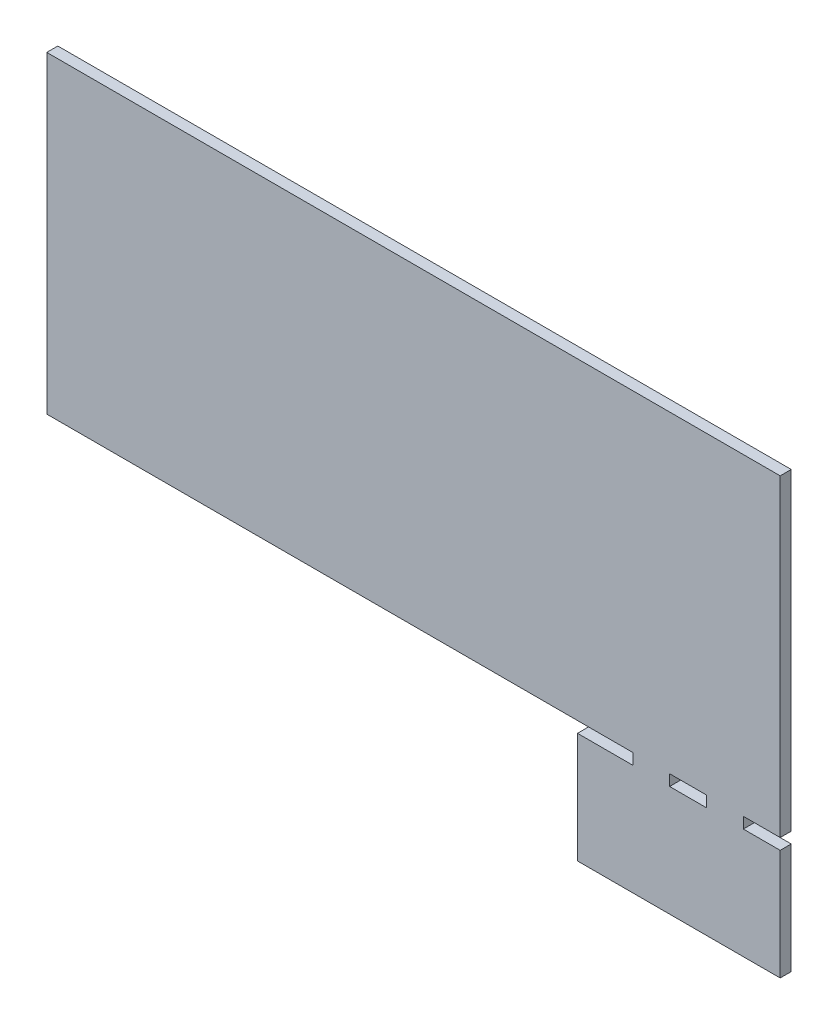
ISO-10303-21;
HEADER;
FILE_DESCRIPTION(('STEP AP214'),'2;1');
FILE_NAME('part.step','',(''),(''),'','','');
FILE_SCHEMA(('AUTOMOTIVE_DESIGN { 1 0 10303 214 1 1 1 1 }'));
ENDSEC;
DATA;
#1=APPLICATION_CONTEXT('core data for automotive mechanical design processes');
#2=APPLICATION_PROTOCOL_DEFINITION('international standard','automotive_design',2000,#1);
#3=PRODUCT_CONTEXT('',#1,'mechanical');
#4=PRODUCT('Part','Part','',(#3));
#5=PRODUCT_RELATED_PRODUCT_CATEGORY('part','',(#4));
#6=PRODUCT_DEFINITION_FORMATION('','',#4);
#7=PRODUCT_DEFINITION_CONTEXT('part definition',#1,'design');
#8=PRODUCT_DEFINITION('design','',#6,#7);
#9=PRODUCT_DEFINITION_SHAPE('','',#8);
#10=(LENGTH_UNIT() NAMED_UNIT(*) SI_UNIT(.MILLI.,.METRE.));
#11=(NAMED_UNIT(*) PLANE_ANGLE_UNIT() SI_UNIT($,.RADIAN.));
#12=(NAMED_UNIT(*) SI_UNIT($,.STERADIAN.) SOLID_ANGLE_UNIT());
#13=UNCERTAINTY_MEASURE_WITH_UNIT(LENGTH_MEASURE(1.E-05),#10,'distance_accuracy_value','');
#14=(GEOMETRIC_REPRESENTATION_CONTEXT(3) GLOBAL_UNCERTAINTY_ASSIGNED_CONTEXT((#13)) GLOBAL_UNIT_ASSIGNED_CONTEXT((#10,
#11,#12)) REPRESENTATION_CONTEXT('',''));
#15=CARTESIAN_POINT('',(0.,0.,0.));
#16=DIRECTION('',(0.,0.,1.));
#17=DIRECTION('',(1.,0.,0.));
#18=AXIS2_PLACEMENT_3D('',#15,#16,#17);
#19=CARTESIAN_POINT('',(0.,0.,3.));
#20=DIRECTION('',(0.,0.,-1.));
#21=DIRECTION('',(-1.,0.,0.));
#22=AXIS2_PLACEMENT_3D('',#19,#20,#21);
#23=PLANE('',#22);
#24=DIRECTION('',(1.,0.,0.));
#25=VECTOR('',#24,1.);
#26=CARTESIAN_POINT('',(27.5,60.5,3.));
#27=LINE('',#26,#25);
#28=CARTESIAN_POINT('',(-171.5,60.5,3.));
#29=VERTEX_POINT('',#28);
#30=CARTESIAN_POINT('',(27.5,60.5,3.));
#31=VERTEX_POINT('',#30);
#32=EDGE_CURVE('E162',#29,#31,#27,.T.);
#33=ORIENTED_EDGE('',*,*,#32,.F.);
#34=DIRECTION('',(0.,1.,0.));
#35=VECTOR('',#34,1.);
#36=CARTESIAN_POINT('',(-171.5,-24.5,3.));
#37=LINE('',#36,#35);
#38=CARTESIAN_POINT('',(-171.5,-24.5,3.));
#39=VERTEX_POINT('',#38);
#40=EDGE_CURVE('E147',#39,#29,#37,.T.);
#41=ORIENTED_EDGE('',*,*,#40,.F.);
#42=DIRECTION('',(-1.,0.,0.));
#43=VECTOR('',#42,1.);
#44=CARTESIAN_POINT('',(-12.5,-24.5,3.));
#45=LINE('',#44,#43);
#46=CARTESIAN_POINT('',(-12.5,-24.5,3.));
#47=VERTEX_POINT('',#46);
#48=EDGE_CURVE('E219',#47,#39,#45,.T.);
#49=ORIENTED_EDGE('',*,*,#48,.F.);
#50=DIRECTION('',(0.,-1.,0.));
#51=VECTOR('',#50,1.);
#52=CARTESIAN_POINT('',(-12.5,-24.5,3.));
#53=LINE('',#52,#51);
#54=CARTESIAN_POINT('',(-12.5,-27.5,3.));
#55=VERTEX_POINT('',#54);
#56=EDGE_CURVE('E215',#47,#55,#53,.T.);
#57=ORIENTED_EDGE('',*,*,#56,.T.);
#58=DIRECTION('',(1.,0.,0.));
#59=VECTOR('',#58,1.);
#60=CARTESIAN_POINT('',(-27.5,-27.5,3.));
#61=LINE('',#60,#59);
#62=CARTESIAN_POINT('',(-27.5,-27.5,3.));
#63=VERTEX_POINT('',#62);
#64=EDGE_CURVE('E182',#63,#55,#61,.T.);
#65=ORIENTED_EDGE('',*,*,#64,.F.);
#66=DIRECTION('',(0.,1.,0.));
#67=VECTOR('',#66,1.);
#68=CARTESIAN_POINT('',(-27.5,-57.5,3.));
#69=LINE('',#68,#67);
#70=CARTESIAN_POINT('',(-27.5,-57.5,3.));
#71=VERTEX_POINT('',#70);
#72=EDGE_CURVE('E177',#71,#63,#69,.T.);
#73=ORIENTED_EDGE('',*,*,#72,.F.);
#74=DIRECTION('',(-1.,0.,0.));
#75=VECTOR('',#74,1.);
#76=CARTESIAN_POINT('',(-27.5,-57.5,3.));
#77=LINE('',#76,#75);
#78=CARTESIAN_POINT('',(27.5,-57.5,3.));
#79=VERTEX_POINT('',#78);
#80=EDGE_CURVE('E188',#79,#71,#77,.T.);
#81=ORIENTED_EDGE('',*,*,#80,.F.);
#82=DIRECTION('',(0.,-1.,0.));
#83=VECTOR('',#82,1.);
#84=CARTESIAN_POINT('',(27.5,-57.5,3.));
#85=LINE('',#84,#83);
#86=CARTESIAN_POINT('',(27.5,-27.5,3.));
#87=VERTEX_POINT('',#86);
#88=EDGE_CURVE('E184',#87,#79,#85,.T.);
#89=ORIENTED_EDGE('',*,*,#88,.F.);
#90=CARTESIAN_POINT('',(17.5,-27.5,3.));
#91=VERTEX_POINT('',#90);
#92=EDGE_CURVE('E180',#91,#87,#61,.T.);
#93=ORIENTED_EDGE('',*,*,#92,.F.);
#94=DIRECTION('',(0.,-1.,0.));
#95=VECTOR('',#94,1.);
#96=CARTESIAN_POINT('',(17.5,-24.5,3.));
#97=LINE('',#96,#95);
#98=CARTESIAN_POINT('',(17.5,-24.5,3.));
#99=VERTEX_POINT('',#98);
#100=EDGE_CURVE('E231',#99,#91,#97,.T.);
#101=ORIENTED_EDGE('',*,*,#100,.F.);
#102=DIRECTION('',(-1.,0.,0.));
#103=VECTOR('',#102,1.);
#104=CARTESIAN_POINT('',(27.5,-24.5,3.));
#105=LINE('',#104,#103);
#106=CARTESIAN_POINT('',(27.5,-24.5,3.));
#107=VERTEX_POINT('',#106);
#108=EDGE_CURVE('E259',#107,#99,#105,.T.);
#109=ORIENTED_EDGE('',*,*,#108,.F.);
#110=DIRECTION('',(0.,1.,0.));
#111=VECTOR('',#110,1.);
#112=CARTESIAN_POINT('',(27.5,-27.5,3.));
#113=LINE('',#112,#111);
#114=EDGE_CURVE('E11',#107,#31,#113,.T.);
#115=ORIENTED_EDGE('',*,*,#114,.T.);
#116=EDGE_LOOP('',(#33,#41,#49,#57,#65,#73,#81,#89,#93,#101,#109,#115));
#117=FACE_BOUND('',#116,.T.);
#118=CARTESIAN_POINT('',(-2.50000000000001,-27.5,3.));
#119=VERTEX_POINT('',#118);
#120=CARTESIAN_POINT('',(7.49999999999999,-27.5,3.));
#121=VERTEX_POINT('',#120);
#122=EDGE_CURVE('E185',#119,#121,#61,.T.);
#123=ORIENTED_EDGE('',*,*,#122,.F.);
#124=DIRECTION('',(0.,-1.,0.));
#125=VECTOR('',#124,1.);
#126=CARTESIAN_POINT('',(-2.50000000000001,-24.5,3.));
#127=LINE('',#126,#125);
#128=CARTESIAN_POINT('',(-2.50000000000001,-24.5,3.));
#129=VERTEX_POINT('',#128);
#130=EDGE_CURVE('E221',#129,#119,#127,.T.);
#131=ORIENTED_EDGE('',*,*,#130,.F.);
#132=DIRECTION('',(-1.,0.,0.));
#133=VECTOR('',#132,1.);
#134=CARTESIAN_POINT('',(7.49999999999999,-24.5,3.));
#135=LINE('',#134,#133);
#136=CARTESIAN_POINT('',(7.49999999999999,-24.5,3.));
#137=VERTEX_POINT('',#136);
#138=EDGE_CURVE('E242',#137,#129,#135,.T.);
#139=ORIENTED_EDGE('',*,*,#138,.F.);
#140=DIRECTION('',(0.,-1.,0.));
#141=VECTOR('',#140,1.);
#142=CARTESIAN_POINT('',(7.49999999999999,-24.5,3.));
#143=LINE('',#142,#141);
#144=EDGE_CURVE('E239',#137,#121,#143,.T.);
#145=ORIENTED_EDGE('',*,*,#144,.T.);
#146=EDGE_LOOP('',(#123,#131,#139,#145));
#147=FACE_BOUND('',#146,.T.);
#148=ADVANCED_FACE('F33',(#117,#147),#23,.F.);
#149=CARTESIAN_POINT('',(0.,0.,0.));
#150=DIRECTION('',(0.,0.,-1.));
#151=DIRECTION('',(-1.,0.,0.));
#152=AXIS2_PLACEMENT_3D('',#149,#150,#151);
#153=PLANE('',#152);
#154=DIRECTION('',(0.,1.,0.));
#155=VECTOR('',#154,1.);
#156=CARTESIAN_POINT('',(-171.5,-24.5,0.));
#157=LINE('',#156,#155);
#158=CARTESIAN_POINT('',(-171.5,-24.5,0.));
#159=VERTEX_POINT('',#158);
#160=CARTESIAN_POINT('',(-171.5,60.5,0.));
#161=VERTEX_POINT('',#160);
#162=EDGE_CURVE('E157',#159,#161,#157,.T.);
#163=ORIENTED_EDGE('',*,*,#162,.T.);
#164=DIRECTION('',(1.,0.,0.));
#165=VECTOR('',#164,1.);
#166=CARTESIAN_POINT('',(27.5,60.5,0.));
#167=LINE('',#166,#165);
#168=CARTESIAN_POINT('',(27.5,60.5,0.));
#169=VERTEX_POINT('',#168);
#170=EDGE_CURVE('E163',#161,#169,#167,.T.);
#171=ORIENTED_EDGE('',*,*,#170,.T.);
#172=DIRECTION('',(0.,1.,0.));
#173=VECTOR('',#172,1.);
#174=CARTESIAN_POINT('',(27.5,-27.5,0.));
#175=LINE('',#174,#173);
#176=CARTESIAN_POINT('',(27.5,-24.5,0.));
#177=VERTEX_POINT('',#176);
#178=EDGE_CURVE('E37',#177,#169,#175,.T.);
#179=ORIENTED_EDGE('',*,*,#178,.F.);
#180=DIRECTION('',(-1.,0.,0.));
#181=VECTOR('',#180,1.);
#182=CARTESIAN_POINT('',(27.5,-24.5,0.));
#183=LINE('',#182,#181);
#184=CARTESIAN_POINT('',(17.5,-24.5,0.));
#185=VERTEX_POINT('',#184);
#186=EDGE_CURVE('E258',#177,#185,#183,.T.);
#187=ORIENTED_EDGE('',*,*,#186,.T.);
#188=DIRECTION('',(0.,-1.,0.));
#189=VECTOR('',#188,1.);
#190=CARTESIAN_POINT('',(17.5,-24.5,0.));
#191=LINE('',#190,#189);
#192=CARTESIAN_POINT('',(17.5,-27.5,0.));
#193=VERTEX_POINT('',#192);
#194=EDGE_CURVE('E262',#185,#193,#191,.T.);
#195=ORIENTED_EDGE('',*,*,#194,.T.);
#196=DIRECTION('',(1.,0.,0.));
#197=VECTOR('',#196,1.);
#198=CARTESIAN_POINT('',(-27.5,-27.5,0.));
#199=LINE('',#198,#197);
#200=CARTESIAN_POINT('',(27.5,-27.5,0.));
#201=VERTEX_POINT('',#200);
#202=EDGE_CURVE('E194',#193,#201,#199,.T.);
#203=ORIENTED_EDGE('',*,*,#202,.T.);
#204=DIRECTION('',(0.,-1.,0.));
#205=VECTOR('',#204,1.);
#206=CARTESIAN_POINT('',(27.5,-57.5,0.));
#207=LINE('',#206,#205);
#208=CARTESIAN_POINT('',(27.5,-57.5,0.));
#209=VERTEX_POINT('',#208);
#210=EDGE_CURVE('E198',#201,#209,#207,.T.);
#211=ORIENTED_EDGE('',*,*,#210,.T.);
#212=DIRECTION('',(-1.,0.,0.));
#213=VECTOR('',#212,1.);
#214=CARTESIAN_POINT('',(-27.5,-57.5,0.));
#215=LINE('',#214,#213);
#216=CARTESIAN_POINT('',(-27.5,-57.5,0.));
#217=VERTEX_POINT('',#216);
#218=EDGE_CURVE('E181',#209,#217,#215,.T.);
#219=ORIENTED_EDGE('',*,*,#218,.T.);
#220=DIRECTION('',(0.,1.,0.));
#221=VECTOR('',#220,1.);
#222=CARTESIAN_POINT('',(-27.5,-57.5,0.));
#223=LINE('',#222,#221);
#224=CARTESIAN_POINT('',(-27.5,-27.5,0.));
#225=VERTEX_POINT('',#224);
#226=EDGE_CURVE('E176',#217,#225,#223,.T.);
#227=ORIENTED_EDGE('',*,*,#226,.T.);
#228=CARTESIAN_POINT('',(-12.5,-27.5,0.));
#229=VERTEX_POINT('',#228);
#230=EDGE_CURVE('E195',#225,#229,#199,.T.);
#231=ORIENTED_EDGE('',*,*,#230,.T.);
#232=DIRECTION('',(0.,-1.,0.));
#233=VECTOR('',#232,1.);
#234=CARTESIAN_POINT('',(-12.5,-24.5,0.));
#235=LINE('',#234,#233);
#236=CARTESIAN_POINT('',(-12.5,-24.5,0.));
#237=VERTEX_POINT('',#236);
#238=EDGE_CURVE('E214',#237,#229,#235,.T.);
#239=ORIENTED_EDGE('',*,*,#238,.F.);
#240=DIRECTION('',(-1.,0.,0.));
#241=VECTOR('',#240,1.);
#242=CARTESIAN_POINT('',(-12.5,-24.5,0.));
#243=LINE('',#242,#241);
#244=EDGE_CURVE('E48',#237,#159,#243,.T.);
#245=ORIENTED_EDGE('',*,*,#244,.T.);
#246=EDGE_LOOP('',(#163,#171,#179,#187,#195,#203,#211,#219,#227,#231,#239,#245));
#247=FACE_BOUND('',#246,.T.);
#248=DIRECTION('',(0.,-1.,0.));
#249=VECTOR('',#248,1.);
#250=CARTESIAN_POINT('',(-2.50000000000001,-24.5,0.));
#251=LINE('',#250,#249);
#252=CARTESIAN_POINT('',(-2.50000000000001,-24.5,0.));
#253=VERTEX_POINT('',#252);
#254=CARTESIAN_POINT('',(-2.50000000000001,-27.5,0.));
#255=VERTEX_POINT('',#254);
#256=EDGE_CURVE('E243',#253,#255,#251,.T.);
#257=ORIENTED_EDGE('',*,*,#256,.T.);
#258=CARTESIAN_POINT('',(7.49999999999999,-27.5,0.));
#259=VERTEX_POINT('',#258);
#260=EDGE_CURVE('E199',#255,#259,#199,.T.);
#261=ORIENTED_EDGE('',*,*,#260,.T.);
#262=DIRECTION('',(0.,-1.,0.));
#263=VECTOR('',#262,1.);
#264=CARTESIAN_POINT('',(7.49999999999999,-24.5,0.));
#265=LINE('',#264,#263);
#266=CARTESIAN_POINT('',(7.49999999999999,-24.5,0.));
#267=VERTEX_POINT('',#266);
#268=EDGE_CURVE('E238',#267,#259,#265,.T.);
#269=ORIENTED_EDGE('',*,*,#268,.F.);
#270=DIRECTION('',(-1.,0.,0.));
#271=VECTOR('',#270,1.);
#272=CARTESIAN_POINT('',(7.49999999999999,-24.5,0.));
#273=LINE('',#272,#271);
#274=EDGE_CURVE('E56',#267,#253,#273,.T.);
#275=ORIENTED_EDGE('',*,*,#274,.T.);
#276=EDGE_LOOP('',(#257,#261,#269,#275));
#277=FACE_BOUND('',#276,.T.);
#278=ADVANCED_FACE('F269',(#247,#277),#153,.T.);
#279=CARTESIAN_POINT('',(27.5,-27.5,3.));
#280=DIRECTION('',(-1.,0.,0.));
#281=DIRECTION('',(0.,0.,1.));
#282=AXIS2_PLACEMENT_3D('',#279,#280,#281);
#283=PLANE('',#282);
#284=ORIENTED_EDGE('',*,*,#114,.F.);
#285=DIRECTION('',(0.,0.,1.));
#286=VECTOR('',#285,1.);
#287=CARTESIAN_POINT('',(27.5,-24.5,0.));
#288=LINE('',#287,#286);
#289=EDGE_CURVE('E256',#177,#107,#288,.T.);
#290=ORIENTED_EDGE('',*,*,#289,.F.);
#291=ORIENTED_EDGE('',*,*,#178,.T.);
#292=DIRECTION('',(0.,0.,-1.));
#293=VECTOR('',#292,1.);
#294=CARTESIAN_POINT('',(27.5,60.5,3.));
#295=LINE('',#294,#293);
#296=EDGE_CURVE('E164',#31,#169,#295,.T.);
#297=ORIENTED_EDGE('',*,*,#296,.F.);
#298=EDGE_LOOP('',(#284,#290,#291,#297));
#299=FACE_BOUND('',#298,.T.);
#300=ADVANCED_FACE('F35',(#299),#283,.F.);
#301=CARTESIAN_POINT('',(17.5,-24.5,0.));
#302=DIRECTION('',(-1.,0.,0.));
#303=DIRECTION('',(0.,0.,1.));
#304=AXIS2_PLACEMENT_3D('',#301,#302,#303);
#305=PLANE('',#304);
#306=ORIENTED_EDGE('',*,*,#100,.T.);
#307=DIRECTION('',(0.,0.,1.));
#308=VECTOR('',#307,1.);
#309=CARTESIAN_POINT('',(17.5,-27.5,0.));
#310=LINE('',#309,#308);
#311=EDGE_CURVE('E206',#193,#91,#310,.T.);
#312=ORIENTED_EDGE('',*,*,#311,.F.);
#313=ORIENTED_EDGE('',*,*,#194,.F.);
#314=DIRECTION('',(0.,0.,1.));
#315=VECTOR('',#314,1.);
#316=CARTESIAN_POINT('',(17.5,-24.5,0.));
#317=LINE('',#316,#315);
#318=EDGE_CURVE('E254',#185,#99,#317,.T.);
#319=ORIENTED_EDGE('',*,*,#318,.T.);
#320=EDGE_LOOP('',(#306,#312,#313,#319));
#321=FACE_BOUND('',#320,.T.);
#322=ADVANCED_FACE('F275',(#321),#305,.F.);
#323=CARTESIAN_POINT('',(27.5,-24.5,0.));
#324=DIRECTION('',(0.,1.,0.));
#325=DIRECTION('',(0.,0.,1.));
#326=AXIS2_PLACEMENT_3D('',#323,#324,#325);
#327=PLANE('',#326);
#328=ORIENTED_EDGE('',*,*,#108,.T.);
#329=ORIENTED_EDGE('',*,*,#318,.F.);
#330=ORIENTED_EDGE('',*,*,#186,.F.);
#331=ORIENTED_EDGE('',*,*,#289,.T.);
#332=EDGE_LOOP('',(#328,#329,#330,#331));
#333=FACE_BOUND('',#332,.T.);
#334=ADVANCED_FACE('F277',(#333),#327,.F.);
#335=CARTESIAN_POINT('',(-2.50000000000001,-24.5,0.));
#336=DIRECTION('',(-1.,0.,0.));
#337=DIRECTION('',(0.,-1.,0.));
#338=AXIS2_PLACEMENT_3D('',#335,#336,#337);
#339=PLANE('',#338);
#340=ORIENTED_EDGE('',*,*,#130,.T.);
#341=DIRECTION('',(0.,0.,1.));
#342=VECTOR('',#341,1.);
#343=CARTESIAN_POINT('',(-2.50000000000001,-27.5,0.));
#344=LINE('',#343,#342);
#345=EDGE_CURVE('E228',#255,#119,#344,.T.);
#346=ORIENTED_EDGE('',*,*,#345,.F.);
#347=ORIENTED_EDGE('',*,*,#256,.F.);
#348=DIRECTION('',(0.,0.,1.));
#349=VECTOR('',#348,1.);
#350=CARTESIAN_POINT('',(-2.50000000000001,-24.5,0.));
#351=LINE('',#350,#349);
#352=EDGE_CURVE('E230',#253,#129,#351,.T.);
#353=ORIENTED_EDGE('',*,*,#352,.T.);
#354=EDGE_LOOP('',(#340,#346,#347,#353));
#355=FACE_BOUND('',#354,.T.);
#356=ADVANCED_FACE('F299',(#355),#339,.F.);
#357=CARTESIAN_POINT('',(7.49999999999999,-24.5,0.));
#358=DIRECTION('',(0.,1.,0.));
#359=DIRECTION('',(0.,0.,1.));
#360=AXIS2_PLACEMENT_3D('',#357,#358,#359);
#361=PLANE('',#360);
#362=ORIENTED_EDGE('',*,*,#138,.T.);
#363=ORIENTED_EDGE('',*,*,#352,.F.);
#364=ORIENTED_EDGE('',*,*,#274,.F.);
#365=DIRECTION('',(0.,0.,1.));
#366=VECTOR('',#365,1.);
#367=CARTESIAN_POINT('',(7.49999999999999,-24.5,0.));
#368=LINE('',#367,#366);
#369=EDGE_CURVE('E233',#267,#137,#368,.T.);
#370=ORIENTED_EDGE('',*,*,#369,.T.);
#371=EDGE_LOOP('',(#362,#363,#364,#370));
#372=FACE_BOUND('',#371,.T.);
#373=ADVANCED_FACE('F296',(#372),#361,.F.);
#374=CARTESIAN_POINT('',(7.49999999999999,-24.5,0.));
#375=DIRECTION('',(-1.,0.,0.));
#376=DIRECTION('',(0.,0.,1.));
#377=AXIS2_PLACEMENT_3D('',#374,#375,#376);
#378=PLANE('',#377);
#379=ORIENTED_EDGE('',*,*,#144,.F.);
#380=ORIENTED_EDGE('',*,*,#369,.F.);
#381=ORIENTED_EDGE('',*,*,#268,.T.);
#382=DIRECTION('',(0.,0.,1.));
#383=VECTOR('',#382,1.);
#384=CARTESIAN_POINT('',(7.49999999999999,-27.5,0.));
#385=LINE('',#384,#383);
#386=EDGE_CURVE('E235',#259,#121,#385,.T.);
#387=ORIENTED_EDGE('',*,*,#386,.T.);
#388=EDGE_LOOP('',(#379,#380,#381,#387));
#389=FACE_BOUND('',#388,.T.);
#390=ADVANCED_FACE('F293',(#389),#378,.T.);
#391=CARTESIAN_POINT('',(-12.5,-24.5,0.));
#392=DIRECTION('',(0.,1.,0.));
#393=DIRECTION('',(0.,0.,1.));
#394=AXIS2_PLACEMENT_3D('',#391,#392,#393);
#395=PLANE('',#394);
#396=ORIENTED_EDGE('',*,*,#48,.T.);
#397=DIRECTION('',(0.,0.,-1.));
#398=VECTOR('',#397,1.);
#399=CARTESIAN_POINT('',(-171.5,-24.5,3.));
#400=LINE('',#399,#398);
#401=EDGE_CURVE('E153',#39,#159,#400,.T.);
#402=ORIENTED_EDGE('',*,*,#401,.T.);
#403=ORIENTED_EDGE('',*,*,#244,.F.);
#404=DIRECTION('',(0.,0.,1.));
#405=VECTOR('',#404,1.);
#406=CARTESIAN_POINT('',(-12.5,-24.5,0.));
#407=LINE('',#406,#405);
#408=EDGE_CURVE('E226',#237,#47,#407,.T.);
#409=ORIENTED_EDGE('',*,*,#408,.T.);
#410=EDGE_LOOP('',(#396,#402,#403,#409));
#411=FACE_BOUND('',#410,.T.);
#412=ADVANCED_FACE('F319',(#411),#395,.F.);
#413=CARTESIAN_POINT('',(-12.5,-24.5,0.));
#414=DIRECTION('',(-1.,0.,0.));
#415=DIRECTION('',(0.,0.,1.));
#416=AXIS2_PLACEMENT_3D('',#413,#414,#415);
#417=PLANE('',#416);
#418=ORIENTED_EDGE('',*,*,#56,.F.);
#419=ORIENTED_EDGE('',*,*,#408,.F.);
#420=ORIENTED_EDGE('',*,*,#238,.T.);
#421=DIRECTION('',(0.,0.,1.));
#422=VECTOR('',#421,1.);
#423=CARTESIAN_POINT('',(-12.5,-27.5,0.));
#424=LINE('',#423,#422);
#425=EDGE_CURVE('E218',#229,#55,#424,.T.);
#426=ORIENTED_EDGE('',*,*,#425,.T.);
#427=EDGE_LOOP('',(#418,#419,#420,#426));
#428=FACE_BOUND('',#427,.T.);
#429=ADVANCED_FACE('F323',(#428),#417,.T.);
#430=CARTESIAN_POINT('',(-27.5,-27.5,3.));
#431=DIRECTION('',(0.,1.,0.));
#432=DIRECTION('',(0.,0.,1.));
#433=AXIS2_PLACEMENT_3D('',#430,#431,#432);
#434=PLANE('',#433);
#435=ORIENTED_EDGE('',*,*,#311,.T.);
#436=ORIENTED_EDGE('',*,*,#92,.T.);
#437=DIRECTION('',(0.,0.,-1.));
#438=VECTOR('',#437,1.);
#439=CARTESIAN_POINT('',(27.5,-27.5,3.));
#440=LINE('',#439,#438);
#441=EDGE_CURVE('E209',#87,#201,#440,.T.);
#442=ORIENTED_EDGE('',*,*,#441,.T.);
#443=ORIENTED_EDGE('',*,*,#202,.F.);
#444=EDGE_LOOP('',(#435,#436,#442,#443));
#445=FACE_BOUND('',#444,.T.);
#446=ADVANCED_FACE('F327',(#445),#434,.T.);
#447=ORIENTED_EDGE('',*,*,#345,.T.);
#448=ORIENTED_EDGE('',*,*,#122,.T.);
#449=ORIENTED_EDGE('',*,*,#386,.F.);
#450=ORIENTED_EDGE('',*,*,#260,.F.);
#451=EDGE_LOOP('',(#447,#448,#449,#450));
#452=FACE_BOUND('',#451,.T.);
#453=ADVANCED_FACE('F287',(#452),#434,.T.);
#454=CARTESIAN_POINT('',(-27.5,-57.5,3.));
#455=DIRECTION('',(-1.,0.,0.));
#456=DIRECTION('',(0.,0.,1.));
#457=AXIS2_PLACEMENT_3D('',#454,#455,#456);
#458=PLANE('',#457);
#459=ORIENTED_EDGE('',*,*,#226,.F.);
#460=DIRECTION('',(0.,0.,-1.));
#461=VECTOR('',#460,1.);
#462=CARTESIAN_POINT('',(-27.5,-57.5,3.));
#463=LINE('',#462,#461);
#464=EDGE_CURVE('E204',#71,#217,#463,.T.);
#465=ORIENTED_EDGE('',*,*,#464,.F.);
#466=ORIENTED_EDGE('',*,*,#72,.T.);
#467=DIRECTION('',(0.,0.,-1.));
#468=VECTOR('',#467,1.);
#469=CARTESIAN_POINT('',(-27.5,-27.5,3.));
#470=LINE('',#469,#468);
#471=EDGE_CURVE('E191',#63,#225,#470,.T.);
#472=ORIENTED_EDGE('',*,*,#471,.T.);
#473=EDGE_LOOP('',(#459,#465,#466,#472));
#474=FACE_BOUND('',#473,.T.);
#475=ADVANCED_FACE('F331',(#474),#458,.T.);
#476=CARTESIAN_POINT('',(-27.5,-57.5,3.));
#477=DIRECTION('',(0.,-1.,0.));
#478=DIRECTION('',(1.,0.,0.));
#479=AXIS2_PLACEMENT_3D('',#476,#477,#478);
#480=PLANE('',#479);
#481=ORIENTED_EDGE('',*,*,#218,.F.);
#482=DIRECTION('',(0.,0.,-1.));
#483=VECTOR('',#482,1.);
#484=CARTESIAN_POINT('',(27.5,-57.5,3.));
#485=LINE('',#484,#483);
#486=EDGE_CURVE('E207',#79,#209,#485,.T.);
#487=ORIENTED_EDGE('',*,*,#486,.F.);
#488=ORIENTED_EDGE('',*,*,#80,.T.);
#489=ORIENTED_EDGE('',*,*,#464,.T.);
#490=EDGE_LOOP('',(#481,#487,#488,#489));
#491=FACE_BOUND('',#490,.T.);
#492=ADVANCED_FACE('F334',(#491),#480,.T.);
#493=CARTESIAN_POINT('',(27.5,-57.5,3.));
#494=DIRECTION('',(1.,0.,0.));
#495=DIRECTION('',(0.,1.,0.));
#496=AXIS2_PLACEMENT_3D('',#493,#494,#495);
#497=PLANE('',#496);
#498=ORIENTED_EDGE('',*,*,#210,.F.);
#499=ORIENTED_EDGE('',*,*,#441,.F.);
#500=ORIENTED_EDGE('',*,*,#88,.T.);
#501=ORIENTED_EDGE('',*,*,#486,.T.);
#502=EDGE_LOOP('',(#498,#499,#500,#501));
#503=FACE_BOUND('',#502,.T.);
#504=ADVANCED_FACE('F339',(#503),#497,.T.);
#505=ORIENTED_EDGE('',*,*,#64,.T.);
#506=ORIENTED_EDGE('',*,*,#425,.F.);
#507=ORIENTED_EDGE('',*,*,#230,.F.);
#508=ORIENTED_EDGE('',*,*,#471,.F.);
#509=EDGE_LOOP('',(#505,#506,#507,#508));
#510=FACE_BOUND('',#509,.T.);
#511=ADVANCED_FACE('F336',(#510),#434,.T.);
#512=CARTESIAN_POINT('',(-171.5,-24.5,3.));
#513=DIRECTION('',(-1.,0.,0.));
#514=DIRECTION('',(0.,0.,1.));
#515=AXIS2_PLACEMENT_3D('',#512,#513,#514);
#516=PLANE('',#515);
#517=ORIENTED_EDGE('',*,*,#40,.T.);
#518=DIRECTION('',(0.,0.,-1.));
#519=VECTOR('',#518,1.);
#520=CARTESIAN_POINT('',(-171.5,60.5,3.));
#521=LINE('',#520,#519);
#522=EDGE_CURVE('E151',#29,#161,#521,.T.);
#523=ORIENTED_EDGE('',*,*,#522,.T.);
#524=ORIENTED_EDGE('',*,*,#162,.F.);
#525=ORIENTED_EDGE('',*,*,#401,.F.);
#526=EDGE_LOOP('',(#517,#523,#524,#525));
#527=FACE_BOUND('',#526,.T.);
#528=ADVANCED_FACE('F149',(#527),#516,.T.);
#529=CARTESIAN_POINT('',(27.5,60.5,3.));
#530=DIRECTION('',(0.,1.,0.));
#531=DIRECTION('',(0.,0.,1.));
#532=AXIS2_PLACEMENT_3D('',#529,#530,#531);
#533=PLANE('',#532);
#534=ORIENTED_EDGE('',*,*,#32,.T.);
#535=ORIENTED_EDGE('',*,*,#296,.T.);
#536=ORIENTED_EDGE('',*,*,#170,.F.);
#537=ORIENTED_EDGE('',*,*,#522,.F.);
#538=EDGE_LOOP('',(#534,#535,#536,#537));
#539=FACE_BOUND('',#538,.T.);
#540=ADVANCED_FACE('F160',(#539),#533,.T.);
#541=CLOSED_SHELL('',(#148,#278,#300,#322,#334,#356,#373,#390,#412,#429,#446,#453,#475,#492,
#504,#511,#528,#540));
#542=MANIFOLD_SOLID_BREP('B2',#541);
#543=ADVANCED_BREP_SHAPE_REPRESENTATION('',(#18,#542),#14);
#544=SHAPE_DEFINITION_REPRESENTATION(#9,#543);
ENDSEC;
END-ISO-10303-21;
